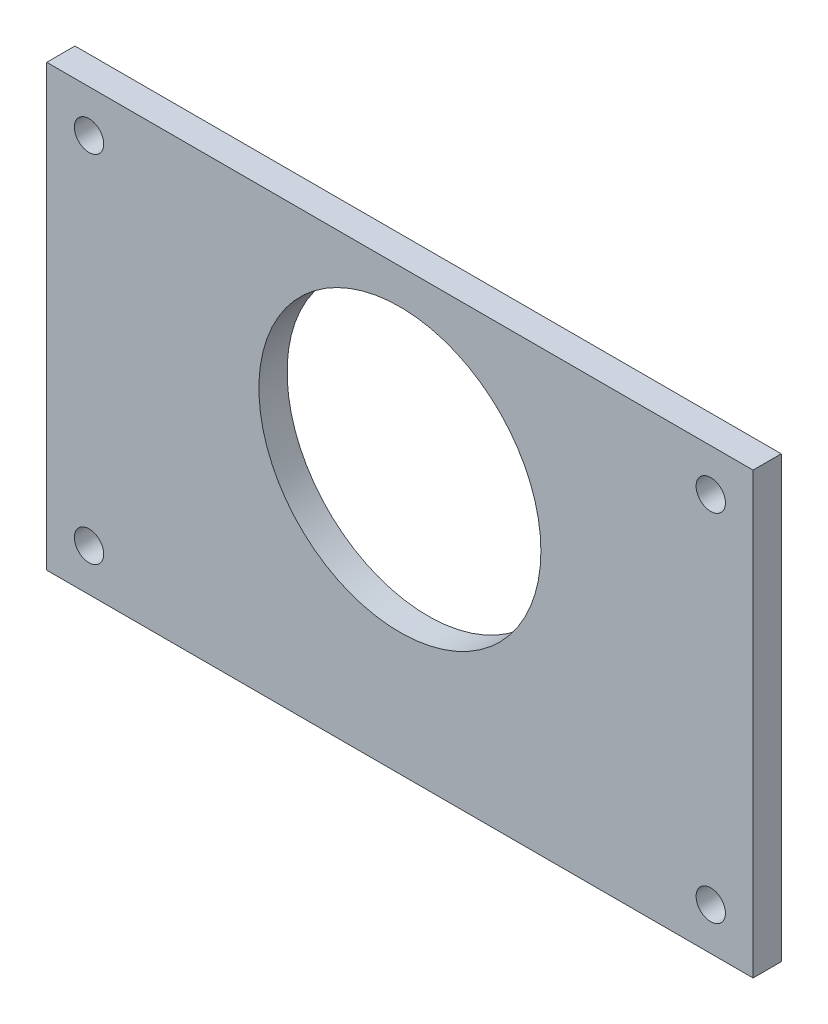
ISO-10303-21;
HEADER;
FILE_DESCRIPTION(('STEP AP214'),'2;1');
FILE_NAME('part.step','',(''),(''),'','','');
FILE_SCHEMA(('AUTOMOTIVE_DESIGN { 1 0 10303 214 1 1 1 1 }'));
ENDSEC;
DATA;
#1=APPLICATION_CONTEXT('core data for automotive mechanical design processes');
#2=APPLICATION_PROTOCOL_DEFINITION('international standard','automotive_design',2000,#1);
#3=PRODUCT_CONTEXT('',#1,'mechanical');
#4=PRODUCT('Part','Part','',(#3));
#5=PRODUCT_RELATED_PRODUCT_CATEGORY('part','',(#4));
#6=PRODUCT_DEFINITION_FORMATION('','',#4);
#7=PRODUCT_DEFINITION_CONTEXT('part definition',#1,'design');
#8=PRODUCT_DEFINITION('design','',#6,#7);
#9=PRODUCT_DEFINITION_SHAPE('','',#8);
#10=(LENGTH_UNIT() NAMED_UNIT(*) SI_UNIT(.MILLI.,.METRE.));
#11=(NAMED_UNIT(*) PLANE_ANGLE_UNIT() SI_UNIT($,.RADIAN.));
#12=(NAMED_UNIT(*) SI_UNIT($,.STERADIAN.) SOLID_ANGLE_UNIT());
#13=UNCERTAINTY_MEASURE_WITH_UNIT(LENGTH_MEASURE(1.E-05),#10,'distance_accuracy_value','');
#14=(GEOMETRIC_REPRESENTATION_CONTEXT(3) GLOBAL_UNCERTAINTY_ASSIGNED_CONTEXT((#13)) GLOBAL_UNIT_ASSIGNED_CONTEXT((#10,
#11,#12)) REPRESENTATION_CONTEXT('',''));
#15=CARTESIAN_POINT('',(0.,0.,0.));
#16=DIRECTION('',(0.,0.,1.));
#17=DIRECTION('',(1.,0.,0.));
#18=AXIS2_PLACEMENT_3D('',#15,#16,#17);
#19=CARTESIAN_POINT('',(0.,0.,2.54));
#20=DIRECTION('',(0.,0.,-1.));
#21=DIRECTION('',(-1.,0.,0.));
#22=AXIS2_PLACEMENT_3D('',#19,#20,#21);
#23=PLANE('',#22);
#24=DIRECTION('',(0.,-1.,0.));
#25=VECTOR('',#24,1.);
#26=CARTESIAN_POINT('',(-31.81,-23.7577,2.54));
#27=LINE('',#26,#25);
#28=CARTESIAN_POINT('',(-31.81,15.8623,2.54));
#29=VERTEX_POINT('',#28);
#30=CARTESIAN_POINT('',(-31.81,-23.7577,2.54));
#31=VERTEX_POINT('',#30);
#32=EDGE_CURVE('E85',#29,#31,#27,.T.);
#33=ORIENTED_EDGE('',*,*,#32,.T.);
#34=DIRECTION('',(1.,0.,0.));
#35=VECTOR('',#34,1.);
#36=CARTESIAN_POINT('',(-31.81,-23.7577,2.54));
#37=LINE('',#36,#35);
#38=CARTESIAN_POINT('',(31.81,-23.7577,2.54));
#39=VERTEX_POINT('',#38);
#40=EDGE_CURVE('E80',#31,#39,#37,.T.);
#41=ORIENTED_EDGE('',*,*,#40,.T.);
#42=DIRECTION('',(0.,1.,0.));
#43=VECTOR('',#42,1.);
#44=CARTESIAN_POINT('',(31.81,-23.7577,2.54));
#45=LINE('',#44,#43);
#46=CARTESIAN_POINT('',(31.81,15.8623,2.54));
#47=VERTEX_POINT('',#46);
#48=EDGE_CURVE('E83',#39,#47,#45,.T.);
#49=ORIENTED_EDGE('',*,*,#48,.T.);
#50=DIRECTION('',(-1.,0.,0.));
#51=VECTOR('',#50,1.);
#52=CARTESIAN_POINT('',(-31.81,15.8623,2.54));
#53=LINE('',#52,#51);
#54=EDGE_CURVE('E50',#47,#29,#53,.T.);
#55=ORIENTED_EDGE('',*,*,#54,.T.);
#56=EDGE_LOOP('',(#33,#41,#49,#55));
#57=FACE_BOUND('',#56,.T.);
#58=CARTESIAN_POINT('',(-28.,-19.9477,2.54));
#59=DIRECTION('',(0.,0.,1.));
#60=DIRECTION('',(1.,0.,0.));
#61=AXIS2_PLACEMENT_3D('',#58,#59,#60);
#62=CIRCLE('',#61,1.3208);
#63=CARTESIAN_POINT('',(-26.6792,-19.9477,2.54));
#64=VERTEX_POINT('',#63);
#65=EDGE_CURVE('E100',#64,#64,#62,.T.);
#66=ORIENTED_EDGE('',*,*,#65,.F.);
#67=EDGE_LOOP('',(#66));
#68=FACE_BOUND('',#67,.T.);
#69=CARTESIAN_POINT('',(28.,-19.9477,2.54));
#70=DIRECTION('',(0.,0.,1.));
#71=DIRECTION('',(1.,0.,0.));
#72=AXIS2_PLACEMENT_3D('',#69,#70,#71);
#73=CIRCLE('',#72,1.3208);
#74=CARTESIAN_POINT('',(29.3208,-19.9477,2.54));
#75=VERTEX_POINT('',#74);
#76=EDGE_CURVE('E115',#75,#75,#73,.T.);
#77=ORIENTED_EDGE('',*,*,#76,.F.);
#78=EDGE_LOOP('',(#77));
#79=FACE_BOUND('',#78,.T.);
#80=CARTESIAN_POINT('',(28.,12.0523,2.54));
#81=DIRECTION('',(0.,0.,1.));
#82=DIRECTION('',(1.,0.,0.));
#83=AXIS2_PLACEMENT_3D('',#80,#81,#82);
#84=CIRCLE('',#83,1.3208);
#85=CARTESIAN_POINT('',(29.3208,12.0523,2.54));
#86=VERTEX_POINT('',#85);
#87=EDGE_CURVE('E121',#86,#86,#84,.T.);
#88=ORIENTED_EDGE('',*,*,#87,.F.);
#89=EDGE_LOOP('',(#88));
#90=FACE_BOUND('',#89,.T.);
#91=CARTESIAN_POINT('',(-28.,12.0523,2.54));
#92=DIRECTION('',(0.,0.,1.));
#93=DIRECTION('',(1.,0.,0.));
#94=AXIS2_PLACEMENT_3D('',#91,#92,#93);
#95=CIRCLE('',#94,1.3208);
#96=CARTESIAN_POINT('',(-26.6792,12.0523,2.54));
#97=VERTEX_POINT('',#96);
#98=EDGE_CURVE('E127',#97,#97,#95,.T.);
#99=ORIENTED_EDGE('',*,*,#98,.F.);
#100=EDGE_LOOP('',(#99));
#101=FACE_BOUND('',#100,.T.);
#102=CARTESIAN_POINT('',(0.,0.,2.54));
#103=DIRECTION('',(0.,0.,1.));
#104=DIRECTION('',(1.,0.,0.));
#105=AXIS2_PLACEMENT_3D('',#102,#103,#104);
#106=CIRCLE('',#105,12.7);
#107=CARTESIAN_POINT('',(12.7,0.,2.54));
#108=VERTEX_POINT('',#107);
#109=EDGE_CURVE('E133',#108,#108,#106,.T.);
#110=ORIENTED_EDGE('',*,*,#109,.F.);
#111=EDGE_LOOP('',(#110));
#112=FACE_BOUND('',#111,.T.);
#113=ADVANCED_FACE('F33',(#57,#68,#79,#90,#101,#112),#23,.F.);
#114=CARTESIAN_POINT('',(0.,0.,0.));
#115=DIRECTION('',(0.,0.,-1.));
#116=DIRECTION('',(-1.,0.,0.));
#117=AXIS2_PLACEMENT_3D('',#114,#115,#116);
#118=PLANE('',#117);
#119=CARTESIAN_POINT('',(-28.,12.0523,0.));
#120=DIRECTION('',(0.,0.,1.));
#121=DIRECTION('',(1.,0.,0.));
#122=AXIS2_PLACEMENT_3D('',#119,#120,#121);
#123=CIRCLE('',#122,1.3208);
#124=CARTESIAN_POINT('',(-26.6792,12.0523,0.));
#125=VERTEX_POINT('',#124);
#126=EDGE_CURVE('E130',#125,#125,#123,.T.);
#127=ORIENTED_EDGE('',*,*,#126,.T.);
#128=EDGE_LOOP('',(#127));
#129=FACE_BOUND('',#128,.T.);
#130=CARTESIAN_POINT('',(28.,-19.9477,0.));
#131=DIRECTION('',(0.,0.,1.));
#132=DIRECTION('',(1.,0.,0.));
#133=AXIS2_PLACEMENT_3D('',#130,#131,#132);
#134=CIRCLE('',#133,1.3208);
#135=CARTESIAN_POINT('',(29.3208,-19.9477,0.));
#136=VERTEX_POINT('',#135);
#137=EDGE_CURVE('E118',#136,#136,#134,.T.);
#138=ORIENTED_EDGE('',*,*,#137,.T.);
#139=EDGE_LOOP('',(#138));
#140=FACE_BOUND('',#139,.T.);
#141=DIRECTION('',(0.,-1.,0.));
#142=VECTOR('',#141,1.);
#143=CARTESIAN_POINT('',(-31.81,-23.7577,0.));
#144=LINE('',#143,#142);
#145=CARTESIAN_POINT('',(-31.81,15.8623,0.));
#146=VERTEX_POINT('',#145);
#147=CARTESIAN_POINT('',(-31.81,-23.7577,0.));
#148=VERTEX_POINT('',#147);
#149=EDGE_CURVE('E97',#146,#148,#144,.T.);
#150=ORIENTED_EDGE('',*,*,#149,.F.);
#151=DIRECTION('',(-1.,0.,0.));
#152=VECTOR('',#151,1.);
#153=CARTESIAN_POINT('',(-31.81,15.8623,0.));
#154=LINE('',#153,#152);
#155=CARTESIAN_POINT('',(31.81,15.8623,0.));
#156=VERTEX_POINT('',#155);
#157=EDGE_CURVE('E73',#156,#146,#154,.T.);
#158=ORIENTED_EDGE('',*,*,#157,.F.);
#159=DIRECTION('',(0.,1.,0.));
#160=VECTOR('',#159,1.);
#161=CARTESIAN_POINT('',(31.81,-23.7577,0.));
#162=LINE('',#161,#160);
#163=CARTESIAN_POINT('',(31.81,-23.7577,0.));
#164=VERTEX_POINT('',#163);
#165=EDGE_CURVE('E67',#164,#156,#162,.T.);
#166=ORIENTED_EDGE('',*,*,#165,.F.);
#167=DIRECTION('',(1.,0.,0.));
#168=VECTOR('',#167,1.);
#169=CARTESIAN_POINT('',(-31.81,-23.7577,0.));
#170=LINE('',#169,#168);
#171=EDGE_CURVE('E89',#148,#164,#170,.T.);
#172=ORIENTED_EDGE('',*,*,#171,.F.);
#173=EDGE_LOOP('',(#150,#158,#166,#172));
#174=FACE_BOUND('',#173,.T.);
#175=CARTESIAN_POINT('',(-28.,-19.9477,0.));
#176=DIRECTION('',(0.,0.,1.));
#177=DIRECTION('',(1.,0.,0.));
#178=AXIS2_PLACEMENT_3D('',#175,#176,#177);
#179=CIRCLE('',#178,1.3208);
#180=CARTESIAN_POINT('',(-26.6792,-19.9477,0.));
#181=VERTEX_POINT('',#180);
#182=EDGE_CURVE('E112',#181,#181,#179,.T.);
#183=ORIENTED_EDGE('',*,*,#182,.T.);
#184=EDGE_LOOP('',(#183));
#185=FACE_BOUND('',#184,.T.);
#186=CARTESIAN_POINT('',(28.,12.0523,0.));
#187=DIRECTION('',(0.,0.,1.));
#188=DIRECTION('',(1.,0.,0.));
#189=AXIS2_PLACEMENT_3D('',#186,#187,#188);
#190=CIRCLE('',#189,1.3208);
#191=CARTESIAN_POINT('',(29.3208,12.0523,0.));
#192=VERTEX_POINT('',#191);
#193=EDGE_CURVE('E124',#192,#192,#190,.T.);
#194=ORIENTED_EDGE('',*,*,#193,.T.);
#195=EDGE_LOOP('',(#194));
#196=FACE_BOUND('',#195,.T.);
#197=CARTESIAN_POINT('',(0.,0.,0.));
#198=DIRECTION('',(0.,0.,1.));
#199=DIRECTION('',(1.,0.,0.));
#200=AXIS2_PLACEMENT_3D('',#197,#198,#199);
#201=CIRCLE('',#200,12.7);
#202=CARTESIAN_POINT('',(12.7,0.,0.));
#203=VERTEX_POINT('',#202);
#204=EDGE_CURVE('E136',#203,#203,#201,.T.);
#205=ORIENTED_EDGE('',*,*,#204,.T.);
#206=EDGE_LOOP('',(#205));
#207=FACE_BOUND('',#206,.T.);
#208=ADVANCED_FACE('F108',(#129,#140,#174,#185,#196,#207),#118,.T.);
#209=CARTESIAN_POINT('',(-31.81,-23.7577,2.54));
#210=DIRECTION('',(1.,0.,0.));
#211=DIRECTION('',(0.,0.,-1.));
#212=AXIS2_PLACEMENT_3D('',#209,#210,#211);
#213=PLANE('',#212);
#214=ORIENTED_EDGE('',*,*,#149,.T.);
#215=DIRECTION('',(0.,0.,-1.));
#216=VECTOR('',#215,1.);
#217=CARTESIAN_POINT('',(-31.81,-23.7577,2.54));
#218=LINE('',#217,#216);
#219=EDGE_CURVE('E11',#31,#148,#218,.T.);
#220=ORIENTED_EDGE('',*,*,#219,.F.);
#221=ORIENTED_EDGE('',*,*,#32,.F.);
#222=DIRECTION('',(0.,0.,-1.));
#223=VECTOR('',#222,1.);
#224=CARTESIAN_POINT('',(-31.81,15.8623,2.54));
#225=LINE('',#224,#223);
#226=EDGE_CURVE('E93',#29,#146,#225,.T.);
#227=ORIENTED_EDGE('',*,*,#226,.T.);
#228=EDGE_LOOP('',(#214,#220,#221,#227));
#229=FACE_BOUND('',#228,.T.);
#230=ADVANCED_FACE('F35',(#229),#213,.F.);
#231=CARTESIAN_POINT('',(-31.81,-23.7577,2.54));
#232=DIRECTION('',(0.,1.,0.));
#233=DIRECTION('',(0.,0.,1.));
#234=AXIS2_PLACEMENT_3D('',#231,#232,#233);
#235=PLANE('',#234);
#236=ORIENTED_EDGE('',*,*,#171,.T.);
#237=DIRECTION('',(0.,0.,-1.));
#238=VECTOR('',#237,1.);
#239=CARTESIAN_POINT('',(31.81,-23.7577,2.54));
#240=LINE('',#239,#238);
#241=EDGE_CURVE('E42',#39,#164,#240,.T.);
#242=ORIENTED_EDGE('',*,*,#241,.F.);
#243=ORIENTED_EDGE('',*,*,#40,.F.);
#244=ORIENTED_EDGE('',*,*,#219,.T.);
#245=EDGE_LOOP('',(#236,#242,#243,#244));
#246=FACE_BOUND('',#245,.T.);
#247=ADVANCED_FACE('F88',(#246),#235,.F.);
#248=CARTESIAN_POINT('',(31.81,-23.7577,2.54));
#249=DIRECTION('',(-1.,0.,0.));
#250=DIRECTION('',(0.,0.,1.));
#251=AXIS2_PLACEMENT_3D('',#248,#249,#250);
#252=PLANE('',#251);
#253=ORIENTED_EDGE('',*,*,#165,.T.);
#254=DIRECTION('',(0.,0.,-1.));
#255=VECTOR('',#254,1.);
#256=CARTESIAN_POINT('',(31.81,15.8623,2.54));
#257=LINE('',#256,#255);
#258=EDGE_CURVE('E90',#47,#156,#257,.T.);
#259=ORIENTED_EDGE('',*,*,#258,.F.);
#260=ORIENTED_EDGE('',*,*,#48,.F.);
#261=ORIENTED_EDGE('',*,*,#241,.T.);
#262=EDGE_LOOP('',(#253,#259,#260,#261));
#263=FACE_BOUND('',#262,.T.);
#264=ADVANCED_FACE('F91',(#263),#252,.F.);
#265=CARTESIAN_POINT('',(-31.81,15.8623,2.54));
#266=DIRECTION('',(0.,-1.,0.));
#267=DIRECTION('',(0.,0.,-1.));
#268=AXIS2_PLACEMENT_3D('',#265,#266,#267);
#269=PLANE('',#268);
#270=ORIENTED_EDGE('',*,*,#157,.T.);
#271=ORIENTED_EDGE('',*,*,#226,.F.);
#272=ORIENTED_EDGE('',*,*,#54,.F.);
#273=ORIENTED_EDGE('',*,*,#258,.T.);
#274=EDGE_LOOP('',(#270,#271,#272,#273));
#275=FACE_BOUND('',#274,.T.);
#276=ADVANCED_FACE('F105',(#275),#269,.F.);
#277=CARTESIAN_POINT('',(-28.,-19.9477,2.54));
#278=DIRECTION('',(0.,0.,-1.));
#279=DIRECTION('',(-1.,0.,0.));
#280=AXIS2_PLACEMENT_3D('',#277,#278,#279);
#281=CYLINDRICAL_SURFACE('',#280,1.3208);
#282=ORIENTED_EDGE('',*,*,#65,.T.);
#283=EDGE_LOOP('',(#282));
#284=FACE_BOUND('',#283,.T.);
#285=ORIENTED_EDGE('',*,*,#182,.F.);
#286=EDGE_LOOP('',(#285));
#287=FACE_BOUND('',#286,.T.);
#288=ADVANCED_FACE('F153',(#284,#287),#281,.F.);
#289=CARTESIAN_POINT('',(28.,-19.9477,2.54));
#290=DIRECTION('',(0.,0.,-1.));
#291=DIRECTION('',(-1.,0.,0.));
#292=AXIS2_PLACEMENT_3D('',#289,#290,#291);
#293=CYLINDRICAL_SURFACE('',#292,1.3208);
#294=ORIENTED_EDGE('',*,*,#76,.T.);
#295=EDGE_LOOP('',(#294));
#296=FACE_BOUND('',#295,.T.);
#297=ORIENTED_EDGE('',*,*,#137,.F.);
#298=EDGE_LOOP('',(#297));
#299=FACE_BOUND('',#298,.T.);
#300=ADVANCED_FACE('F199',(#296,#299),#293,.F.);
#301=CARTESIAN_POINT('',(28.,12.0523,2.54));
#302=DIRECTION('',(0.,0.,-1.));
#303=DIRECTION('',(-1.,0.,0.));
#304=AXIS2_PLACEMENT_3D('',#301,#302,#303);
#305=CYLINDRICAL_SURFACE('',#304,1.3208);
#306=ORIENTED_EDGE('',*,*,#87,.T.);
#307=EDGE_LOOP('',(#306));
#308=FACE_BOUND('',#307,.T.);
#309=ORIENTED_EDGE('',*,*,#193,.F.);
#310=EDGE_LOOP('',(#309));
#311=FACE_BOUND('',#310,.T.);
#312=ADVANCED_FACE('F207',(#308,#311),#305,.F.);
#313=CARTESIAN_POINT('',(-28.,12.0523,2.54));
#314=DIRECTION('',(0.,0.,-1.));
#315=DIRECTION('',(-1.,0.,0.));
#316=AXIS2_PLACEMENT_3D('',#313,#314,#315);
#317=CYLINDRICAL_SURFACE('',#316,1.3208);
#318=ORIENTED_EDGE('',*,*,#98,.T.);
#319=EDGE_LOOP('',(#318));
#320=FACE_BOUND('',#319,.T.);
#321=ORIENTED_EDGE('',*,*,#126,.F.);
#322=EDGE_LOOP('',(#321));
#323=FACE_BOUND('',#322,.T.);
#324=ADVANCED_FACE('F215',(#320,#323),#317,.F.);
#325=CARTESIAN_POINT('',(0.,0.,2.54));
#326=DIRECTION('',(0.,0.,-1.));
#327=DIRECTION('',(-1.,0.,0.));
#328=AXIS2_PLACEMENT_3D('',#325,#326,#327);
#329=CYLINDRICAL_SURFACE('',#328,12.7);
#330=ORIENTED_EDGE('',*,*,#109,.T.);
#331=EDGE_LOOP('',(#330));
#332=FACE_BOUND('',#331,.T.);
#333=ORIENTED_EDGE('',*,*,#204,.F.);
#334=EDGE_LOOP('',(#333));
#335=FACE_BOUND('',#334,.T.);
#336=ADVANCED_FACE('F142',(#332,#335),#329,.F.);
#337=CLOSED_SHELL('',(#113,#208,#230,#247,#264,#276,#288,#300,#312,#324,#336));
#338=MANIFOLD_SOLID_BREP('B2',#337);
#339=ADVANCED_BREP_SHAPE_REPRESENTATION('',(#18,#338),#14);
#340=SHAPE_DEFINITION_REPRESENTATION(#9,#339);
ENDSEC;
END-ISO-10303-21;
